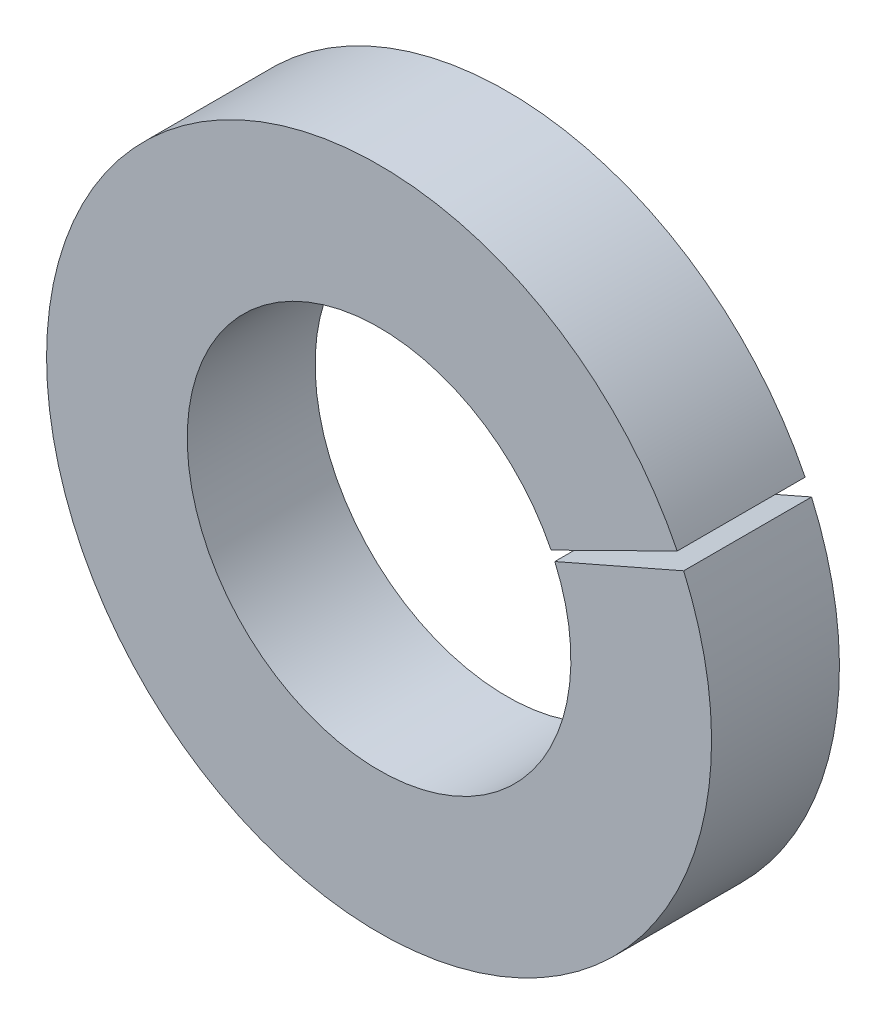
ISO-10303-21;
HEADER;
FILE_DESCRIPTION(('STEP AP214'),'2;1');
FILE_NAME('part.step','',(''),(''),'','','');
FILE_SCHEMA(('AUTOMOTIVE_DESIGN { 1 0 10303 214 1 1 1 1 }'));
ENDSEC;
DATA;
#1=APPLICATION_CONTEXT('core data for automotive mechanical design processes');
#2=APPLICATION_PROTOCOL_DEFINITION('international standard','automotive_design',2000,#1);
#3=PRODUCT_CONTEXT('',#1,'mechanical');
#4=PRODUCT('Part','Part','',(#3));
#5=PRODUCT_RELATED_PRODUCT_CATEGORY('part','',(#4));
#6=PRODUCT_DEFINITION_FORMATION('','',#4);
#7=PRODUCT_DEFINITION_CONTEXT('part definition',#1,'design');
#8=PRODUCT_DEFINITION('design','',#6,#7);
#9=PRODUCT_DEFINITION_SHAPE('','',#8);
#10=(LENGTH_UNIT() NAMED_UNIT(*) SI_UNIT(.MILLI.,.METRE.));
#11=(NAMED_UNIT(*) PLANE_ANGLE_UNIT() SI_UNIT($,.RADIAN.));
#12=(NAMED_UNIT(*) SI_UNIT($,.STERADIAN.) SOLID_ANGLE_UNIT());
#13=UNCERTAINTY_MEASURE_WITH_UNIT(LENGTH_MEASURE(1.E-05),#10,'distance_accuracy_value','');
#14=(GEOMETRIC_REPRESENTATION_CONTEXT(3) GLOBAL_UNCERTAINTY_ASSIGNED_CONTEXT((#13)) GLOBAL_UNIT_ASSIGNED_CONTEXT((#10,
#11,#12)) REPRESENTATION_CONTEXT('',''));
#15=CARTESIAN_POINT('',(0.,0.,0.));
#16=DIRECTION('',(0.,0.,1.));
#17=DIRECTION('',(1.,0.,0.));
#18=AXIS2_PLACEMENT_3D('',#15,#16,#17);
#19=CARTESIAN_POINT('',(0.,0.,1.));
#20=DIRECTION('',(0.,0.,1.));
#21=DIRECTION('',(1.,0.,0.));
#22=AXIS2_PLACEMENT_3D('',#19,#20,#21);
#23=PLANE('',#22);
#24=DIRECTION('',(0.91612800253932,0.400885872741003,0.));
#25=VECTOR('',#24,1.);
#26=CARTESIAN_POINT('',(4.81245926481222,2.10587049741662,1.));
#27=LINE('',#26,#25);
#28=CARTESIAN_POINT('',(1.37419200380898,0.601328809111504,1.));
#29=VERTEX_POINT('',#28);
#30=CARTESIAN_POINT('',(2.38193280660223,1.04230326912661,1.));
#31=VERTEX_POINT('',#30);
#32=EDGE_CURVE('E81',#29,#31,#27,.T.);
#33=ORIENTED_EDGE('',*,*,#32,.F.);
#34=CARTESIAN_POINT('',(0.,0.,1.));
#35=DIRECTION('',(0.,0.,1.));
#36=DIRECTION('',(1.,0.,0.));
#37=AXIS2_PLACEMENT_3D('',#34,#35,#36);
#38=CIRCLE('',#37,1.5);
#39=CARTESIAN_POINT('',(1.34505069476121,0.663956797180657,1.));
#40=VERTEX_POINT('',#39);
#41=EDGE_CURVE('E90',#40,#29,#38,.T.);
#42=ORIENTED_EDGE('',*,*,#41,.F.);
#43=DIRECTION('',(-0.896700463174137,-0.442637864787105,0.));
#44=VECTOR('',#43,1.);
#45=CARTESIAN_POINT('',(0.,0.,1.));
#46=LINE('',#45,#44);
#47=CARTESIAN_POINT('',(2.33142120425276,1.15085844844647,1.));
#48=VERTEX_POINT('',#47);
#49=EDGE_CURVE('E64',#48,#40,#46,.T.);
#50=ORIENTED_EDGE('',*,*,#49,.F.);
#51=CARTESIAN_POINT('',(0.,0.,1.));
#52=DIRECTION('',(0.,0.,1.));
#53=DIRECTION('',(1.,0.,0.));
#54=AXIS2_PLACEMENT_3D('',#51,#52,#53);
#55=CIRCLE('',#54,2.6);
#56=EDGE_CURVE('E92',#48,#31,#55,.T.);
#57=ORIENTED_EDGE('',*,*,#56,.T.);
#58=EDGE_LOOP('',(#33,#42,#50,#57));
#59=FACE_BOUND('',#58,.T.);
#60=ADVANCED_FACE('F41',(#59),#23,.T.);
#61=CARTESIAN_POINT('',(0.,0.,0.));
#62=DIRECTION('',(0.,0.,1.));
#63=DIRECTION('',(1.,0.,0.));
#64=AXIS2_PLACEMENT_3D('',#61,#62,#63);
#65=PLANE('',#64);
#66=CARTESIAN_POINT('',(0.,0.,0.));
#67=DIRECTION('',(0.,0.,1.));
#68=DIRECTION('',(1.,0.,0.));
#69=AXIS2_PLACEMENT_3D('',#66,#67,#68);
#70=CIRCLE('',#69,1.5);
#71=CARTESIAN_POINT('',(1.34505069476121,0.663956797180657,0.));
#72=VERTEX_POINT('',#71);
#73=CARTESIAN_POINT('',(1.37419200380898,0.601328809111504,0.));
#74=VERTEX_POINT('',#73);
#75=EDGE_CURVE('E98',#72,#74,#70,.T.);
#76=ORIENTED_EDGE('',*,*,#75,.T.);
#77=DIRECTION('',(0.91612800253932,0.400885872741003,0.));
#78=VECTOR('',#77,1.);
#79=CARTESIAN_POINT('',(0.,0.,0.));
#80=LINE('',#79,#78);
#81=CARTESIAN_POINT('',(2.38193280660223,1.04230326912661,0.));
#82=VERTEX_POINT('',#81);
#83=EDGE_CURVE('E56',#74,#82,#80,.T.);
#84=ORIENTED_EDGE('',*,*,#83,.T.);
#85=CARTESIAN_POINT('',(0.,0.,0.));
#86=DIRECTION('',(0.,0.,1.));
#87=DIRECTION('',(1.,0.,0.));
#88=AXIS2_PLACEMENT_3D('',#85,#86,#87);
#89=CIRCLE('',#88,2.6);
#90=CARTESIAN_POINT('',(2.33142120425276,1.15085844844647,0.));
#91=VERTEX_POINT('',#90);
#92=EDGE_CURVE('E97',#91,#82,#89,.T.);
#93=ORIENTED_EDGE('',*,*,#92,.F.);
#94=DIRECTION('',(-0.896700463174138,-0.442637864787105,0.));
#95=VECTOR('',#94,1.);
#96=CARTESIAN_POINT('',(0.,0.,0.));
#97=LINE('',#96,#95);
#98=EDGE_CURVE('E113',#91,#72,#97,.T.);
#99=ORIENTED_EDGE('',*,*,#98,.T.);
#100=EDGE_LOOP('',(#76,#84,#93,#99));
#101=FACE_BOUND('',#100,.T.);
#102=ADVANCED_FACE('F117',(#101),#65,.F.);
#103=CARTESIAN_POINT('',(0.,0.,1.));
#104=DIRECTION('',(0.,0.,-1.));
#105=DIRECTION('',(-1.,0.,0.));
#106=AXIS2_PLACEMENT_3D('',#103,#104,#105);
#107=CYLINDRICAL_SURFACE('',#106,2.6);
#108=ORIENTED_EDGE('',*,*,#92,.T.);
#109=DIRECTION('',(0.,0.,-1.));
#110=VECTOR('',#109,1.);
#111=CARTESIAN_POINT('',(2.38193280660223,1.04230326912661,1.));
#112=LINE('',#111,#110);
#113=EDGE_CURVE('E104',#82,#31,#112,.F.);
#114=ORIENTED_EDGE('',*,*,#113,.T.);
#115=ORIENTED_EDGE('',*,*,#56,.F.);
#116=DIRECTION('',(0.,0.,-1.));
#117=VECTOR('',#116,1.);
#118=CARTESIAN_POINT('',(2.33142120425276,1.15085844844647,1.));
#119=LINE('',#118,#117);
#120=EDGE_CURVE('E119',#48,#91,#119,.T.);
#121=ORIENTED_EDGE('',*,*,#120,.T.);
#122=EDGE_LOOP('',(#108,#114,#115,#121));
#123=FACE_BOUND('',#122,.T.);
#124=ADVANCED_FACE('F43',(#123),#107,.T.);
#125=CARTESIAN_POINT('',(0.,0.,1.));
#126=DIRECTION('',(0.,0.,-1.));
#127=DIRECTION('',(-1.,0.,0.));
#128=AXIS2_PLACEMENT_3D('',#125,#126,#127);
#129=CYLINDRICAL_SURFACE('',#128,1.5);
#130=DIRECTION('',(0.,0.,-1.));
#131=VECTOR('',#130,1.);
#132=CARTESIAN_POINT('',(1.37419200380898,0.601328809111505,1.));
#133=LINE('',#132,#131);
#134=EDGE_CURVE('E11',#74,#29,#133,.F.);
#135=ORIENTED_EDGE('',*,*,#134,.F.);
#136=ORIENTED_EDGE('',*,*,#75,.F.);
#137=DIRECTION('',(0.,0.,-1.));
#138=VECTOR('',#137,1.);
#139=CARTESIAN_POINT('',(1.34505069476121,0.663956797180657,1.));
#140=LINE('',#139,#138);
#141=EDGE_CURVE('E50',#40,#72,#140,.T.);
#142=ORIENTED_EDGE('',*,*,#141,.F.);
#143=ORIENTED_EDGE('',*,*,#41,.T.);
#144=EDGE_LOOP('',(#135,#136,#142,#143));
#145=FACE_BOUND('',#144,.T.);
#146=ADVANCED_FACE('F95',(#145),#129,.F.);
#147=CARTESIAN_POINT('',(0.,0.,-9.));
#148=DIRECTION('',(-0.442637864787105,0.896700463174138,0.));
#149=DIRECTION('',(-0.896700463174138,-0.442637864787105,0.));
#150=AXIS2_PLACEMENT_3D('',#147,#148,#149);
#151=PLANE('',#150);
#152=ORIENTED_EDGE('',*,*,#49,.T.);
#153=ORIENTED_EDGE('',*,*,#141,.T.);
#154=ORIENTED_EDGE('',*,*,#98,.F.);
#155=ORIENTED_EDGE('',*,*,#120,.F.);
#156=EDGE_LOOP('',(#152,#153,#154,#155));
#157=FACE_BOUND('',#156,.T.);
#158=ADVANCED_FACE('F112',(#157),#151,.F.);
#159=CARTESIAN_POINT('',(4.81245926481222,2.10587049741662,-9.));
#160=DIRECTION('',(0.400885872741003,-0.91612800253932,0.));
#161=DIRECTION('',(0.91612800253932,0.400885872741003,0.));
#162=AXIS2_PLACEMENT_3D('',#159,#160,#161);
#163=PLANE('',#162);
#164=ORIENTED_EDGE('',*,*,#83,.F.);
#165=ORIENTED_EDGE('',*,*,#134,.T.);
#166=ORIENTED_EDGE('',*,*,#32,.T.);
#167=ORIENTED_EDGE('',*,*,#113,.F.);
#168=EDGE_LOOP('',(#164,#165,#166,#167));
#169=FACE_BOUND('',#168,.T.);
#170=ADVANCED_FACE('F80',(#169),#163,.F.);
#171=CLOSED_SHELL('',(#60,#102,#124,#146,#158,#170));
#172=MANIFOLD_SOLID_BREP('B2',#171);
#173=ADVANCED_BREP_SHAPE_REPRESENTATION('',(#18,#172),#14);
#174=SHAPE_DEFINITION_REPRESENTATION(#9,#173);
ENDSEC;
END-ISO-10303-21;
